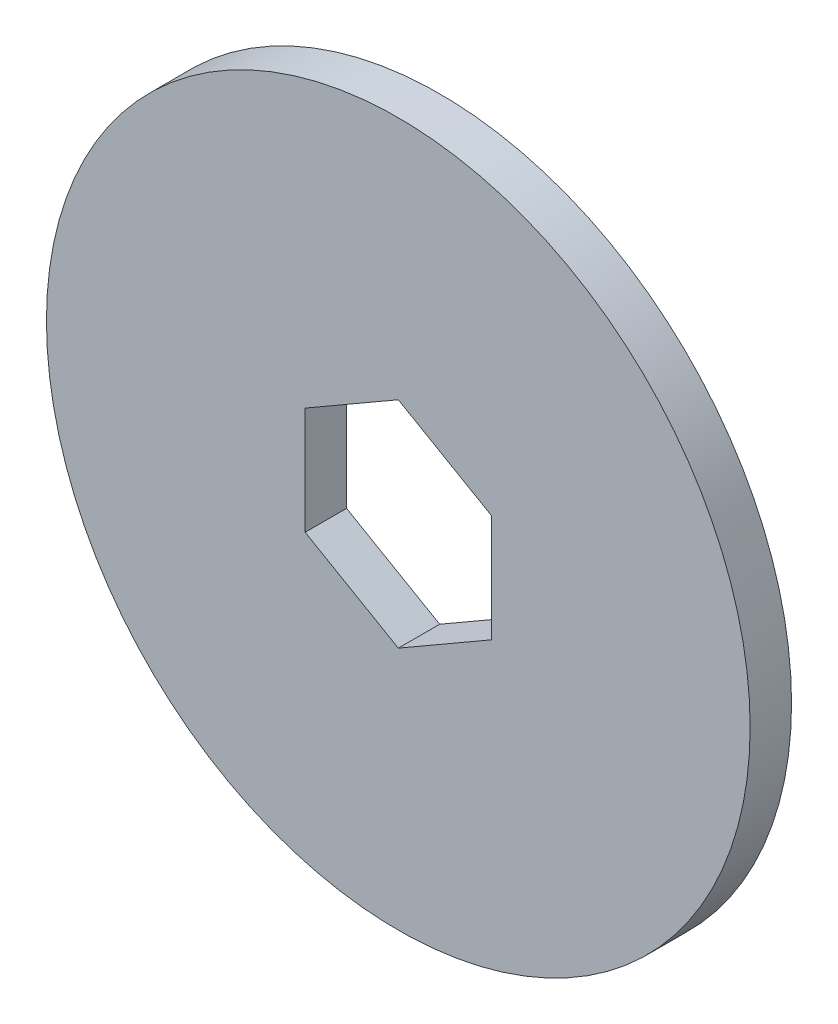
ISO-10303-21;
HEADER;
FILE_DESCRIPTION(('STEP AP214'),'2;1');
FILE_NAME('part.step','',(''),(''),'','','');
FILE_SCHEMA(('AUTOMOTIVE_DESIGN { 1 0 10303 214 1 1 1 1 }'));
ENDSEC;
DATA;
#1=APPLICATION_CONTEXT('core data for automotive mechanical design processes');
#2=APPLICATION_PROTOCOL_DEFINITION('international standard','automotive_design',2000,#1);
#3=PRODUCT_CONTEXT('',#1,'mechanical');
#4=PRODUCT('Part','Part','',(#3));
#5=PRODUCT_RELATED_PRODUCT_CATEGORY('part','',(#4));
#6=PRODUCT_DEFINITION_FORMATION('','',#4);
#7=PRODUCT_DEFINITION_CONTEXT('part definition',#1,'design');
#8=PRODUCT_DEFINITION('design','',#6,#7);
#9=PRODUCT_DEFINITION_SHAPE('','',#8);
#10=(LENGTH_UNIT() NAMED_UNIT(*) SI_UNIT(.MILLI.,.METRE.));
#11=(NAMED_UNIT(*) PLANE_ANGLE_UNIT() SI_UNIT($,.RADIAN.));
#12=(NAMED_UNIT(*) SI_UNIT($,.STERADIAN.) SOLID_ANGLE_UNIT());
#13=UNCERTAINTY_MEASURE_WITH_UNIT(LENGTH_MEASURE(1.E-05),#10,'distance_accuracy_value','');
#14=(GEOMETRIC_REPRESENTATION_CONTEXT(3) GLOBAL_UNCERTAINTY_ASSIGNED_CONTEXT((#13)) GLOBAL_UNIT_ASSIGNED_CONTEXT((#10,
#11,#12)) REPRESENTATION_CONTEXT('',''));
#15=CARTESIAN_POINT('',(0.,0.,0.));
#16=DIRECTION('',(0.,0.,1.));
#17=DIRECTION('',(1.,0.,0.));
#18=AXIS2_PLACEMENT_3D('',#15,#16,#17);
#19=CARTESIAN_POINT('',(642.300000000008,-191.99999999999,6.));
#20=DIRECTION('',(0.,0.,1.));
#21=DIRECTION('',(1.,0.,0.));
#22=AXIS2_PLACEMENT_3D('',#19,#20,#21);
#23=PLANE('',#22);
#24=DIRECTION('',(0.,-1.,0.));
#25=VECTOR('',#24,1.);
#26=CARTESIAN_POINT('',(628.800000000008,-184.20577136589,6.));
#27=LINE('',#26,#25);
#28=CARTESIAN_POINT('',(628.800000000008,-184.20577136589,6.));
#29=VERTEX_POINT('',#28);
#30=CARTESIAN_POINT('',(628.800000000008,-199.79422863409,6.));
#31=VERTEX_POINT('',#30);
#32=EDGE_CURVE('E94',#29,#31,#27,.T.);
#33=ORIENTED_EDGE('',*,*,#32,.F.);
#34=DIRECTION('',(-0.866025403786105,-0.499999999997114,0.));
#35=VECTOR('',#34,1.);
#36=CARTESIAN_POINT('',(642.300000000008,-176.41154273189,6.));
#37=LINE('',#36,#35);
#38=CARTESIAN_POINT('',(642.300000000008,-176.41154273189,6.));
#39=VERTEX_POINT('',#38);
#40=EDGE_CURVE('E87',#39,#29,#37,.T.);
#41=ORIENTED_EDGE('',*,*,#40,.F.);
#42=DIRECTION('',(-0.8660254037845,0.499999999999893,0.));
#43=VECTOR('',#42,1.);
#44=CARTESIAN_POINT('',(655.799999999908,-184.20577136589,6.));
#45=LINE('',#44,#43);
#46=CARTESIAN_POINT('',(655.799999999908,-184.20577136589,6.));
#47=VERTEX_POINT('',#46);
#48=EDGE_CURVE('E114',#47,#39,#45,.T.);
#49=ORIENTED_EDGE('',*,*,#48,.F.);
#50=DIRECTION('',(0.,1.,0.));
#51=VECTOR('',#50,1.);
#52=CARTESIAN_POINT('',(655.799999999908,-199.79422863409,6.));
#53=LINE('',#52,#51);
#54=CARTESIAN_POINT('',(655.799999999908,-199.79422863409,6.));
#55=VERTEX_POINT('',#54);
#56=EDGE_CURVE('E112',#55,#47,#53,.T.);
#57=ORIENTED_EDGE('',*,*,#56,.F.);
#58=DIRECTION('',(0.8660254037845,0.499999999999893,0.));
#59=VECTOR('',#58,1.);
#60=CARTESIAN_POINT('',(642.300000000008,-207.58845726809,6.));
#61=LINE('',#60,#59);
#62=CARTESIAN_POINT('',(642.300000000008,-207.58845726809,6.));
#63=VERTEX_POINT('',#62);
#64=EDGE_CURVE('E107',#63,#55,#61,.T.);
#65=ORIENTED_EDGE('',*,*,#64,.F.);
#66=DIRECTION('',(0.866025403786105,-0.499999999997114,0.));
#67=VECTOR('',#66,1.);
#68=CARTESIAN_POINT('',(628.800000000008,-199.79422863409,6.));
#69=LINE('',#68,#67);
#70=EDGE_CURVE('E105',#31,#63,#69,.T.);
#71=ORIENTED_EDGE('',*,*,#70,.F.);
#72=EDGE_LOOP('',(#33,#41,#49,#57,#65,#71));
#73=FACE_BOUND('',#72,.T.);
#74=CARTESIAN_POINT('',(642.300000000008,-191.99999999999,6.));
#75=DIRECTION('',(0.,0.,1.));
#76=DIRECTION('',(1.,0.,0.));
#77=AXIS2_PLACEMENT_3D('',#74,#75,#76);
#78=CIRCLE('',#77,51.0000000000001);
#79=CARTESIAN_POINT('',(693.300000000008,-191.99999999999,6.));
#80=VERTEX_POINT('',#79);
#81=EDGE_CURVE('E223',#80,#80,#78,.T.);
#82=ORIENTED_EDGE('',*,*,#81,.T.);
#83=EDGE_LOOP('',(#82));
#84=FACE_BOUND('',#83,.T.);
#85=ADVANCED_FACE('F35',(#73,#84),#23,.T.);
#86=CARTESIAN_POINT('',(642.300000000008,-191.99999999999,0.));
#87=DIRECTION('',(0.,0.,1.));
#88=DIRECTION('',(1.,0.,0.));
#89=AXIS2_PLACEMENT_3D('',#86,#87,#88);
#90=PLANE('',#89);
#91=DIRECTION('',(-0.866025403786105,-0.499999999997114,0.));
#92=VECTOR('',#91,1.);
#93=CARTESIAN_POINT('',(642.300000000008,-176.41154273189,0.));
#94=LINE('',#93,#92);
#95=CARTESIAN_POINT('',(642.300000000008,-176.41154273189,0.));
#96=VERTEX_POINT('',#95);
#97=CARTESIAN_POINT('',(628.800000000008,-184.20577136589,0.));
#98=VERTEX_POINT('',#97);
#99=EDGE_CURVE('E57',#96,#98,#94,.T.);
#100=ORIENTED_EDGE('',*,*,#99,.T.);
#101=DIRECTION('',(0.,-1.,0.));
#102=VECTOR('',#101,1.);
#103=CARTESIAN_POINT('',(628.800000000008,-184.20577136589,0.));
#104=LINE('',#103,#102);
#105=CARTESIAN_POINT('',(628.800000000008,-199.79422863409,0.));
#106=VERTEX_POINT('',#105);
#107=EDGE_CURVE('E101',#98,#106,#104,.T.);
#108=ORIENTED_EDGE('',*,*,#107,.T.);
#109=DIRECTION('',(0.866025403786105,-0.499999999997114,0.));
#110=VECTOR('',#109,1.);
#111=CARTESIAN_POINT('',(628.800000000008,-199.79422863409,0.));
#112=LINE('',#111,#110);
#113=CARTESIAN_POINT('',(642.300000000008,-207.58845726809,0.));
#114=VERTEX_POINT('',#113);
#115=EDGE_CURVE('E119',#106,#114,#112,.T.);
#116=ORIENTED_EDGE('',*,*,#115,.T.);
#117=DIRECTION('',(0.8660254037845,0.499999999999893,0.));
#118=VECTOR('',#117,1.);
#119=CARTESIAN_POINT('',(642.300000000008,-207.58845726809,0.));
#120=LINE('',#119,#118);
#121=CARTESIAN_POINT('',(655.799999999908,-199.79422863409,0.));
#122=VERTEX_POINT('',#121);
#123=EDGE_CURVE('E122',#114,#122,#120,.T.);
#124=ORIENTED_EDGE('',*,*,#123,.T.);
#125=DIRECTION('',(0.,1.,0.));
#126=VECTOR('',#125,1.);
#127=CARTESIAN_POINT('',(655.799999999908,-199.79422863409,0.));
#128=LINE('',#127,#126);
#129=CARTESIAN_POINT('',(655.799999999908,-184.20577136589,0.));
#130=VERTEX_POINT('',#129);
#131=EDGE_CURVE('E125',#122,#130,#128,.T.);
#132=ORIENTED_EDGE('',*,*,#131,.T.);
#133=DIRECTION('',(-0.8660254037845,0.499999999999893,0.));
#134=VECTOR('',#133,1.);
#135=CARTESIAN_POINT('',(655.799999999908,-184.20577136589,0.));
#136=LINE('',#135,#134);
#137=EDGE_CURVE('E95',#130,#96,#136,.T.);
#138=ORIENTED_EDGE('',*,*,#137,.T.);
#139=EDGE_LOOP('',(#100,#108,#116,#124,#132,#138));
#140=FACE_BOUND('',#139,.T.);
#141=CARTESIAN_POINT('',(642.300000000008,-191.99999999999,0.));
#142=DIRECTION('',(0.,0.,1.));
#143=DIRECTION('',(1.,0.,0.));
#144=AXIS2_PLACEMENT_3D('',#141,#142,#143);
#145=CIRCLE('',#144,51.0000000000001);
#146=CARTESIAN_POINT('',(693.300000000008,-191.99999999999,0.));
#147=VERTEX_POINT('',#146);
#148=EDGE_CURVE('E117',#147,#147,#145,.T.);
#149=ORIENTED_EDGE('',*,*,#148,.F.);
#150=EDGE_LOOP('',(#149));
#151=FACE_BOUND('',#150,.T.);
#152=ADVANCED_FACE('F37',(#140,#151),#90,.F.);
#153=CARTESIAN_POINT('',(642.300000000008,-176.41154273189,6.));
#154=DIRECTION('',(0.499999999997114,-0.866025403786105,0.));
#155=DIRECTION('',(0.866025403786105,0.499999999997114,0.));
#156=AXIS2_PLACEMENT_3D('',#153,#154,#155);
#157=PLANE('',#156);
#158=ORIENTED_EDGE('',*,*,#99,.F.);
#159=DIRECTION('',(0.,0.,-1.));
#160=VECTOR('',#159,1.);
#161=CARTESIAN_POINT('',(642.300000000008,-176.41154273189,6.));
#162=LINE('',#161,#160);
#163=EDGE_CURVE('E90',#39,#96,#162,.T.);
#164=ORIENTED_EDGE('',*,*,#163,.F.);
#165=ORIENTED_EDGE('',*,*,#40,.T.);
#166=DIRECTION('',(0.,0.,-1.));
#167=VECTOR('',#166,1.);
#168=CARTESIAN_POINT('',(628.800000000008,-184.20577136589,6.));
#169=LINE('',#168,#167);
#170=EDGE_CURVE('E11',#29,#98,#169,.T.);
#171=ORIENTED_EDGE('',*,*,#170,.T.);
#172=EDGE_LOOP('',(#158,#164,#165,#171));
#173=FACE_BOUND('',#172,.T.);
#174=ADVANCED_FACE('F89',(#173),#157,.T.);
#175=CARTESIAN_POINT('',(628.800000000008,-184.20577136589,6.));
#176=DIRECTION('',(1.,0.,0.));
#177=DIRECTION('',(0.,0.,-1.));
#178=AXIS2_PLACEMENT_3D('',#175,#176,#177);
#179=PLANE('',#178);
#180=ORIENTED_EDGE('',*,*,#107,.F.);
#181=ORIENTED_EDGE('',*,*,#170,.F.);
#182=ORIENTED_EDGE('',*,*,#32,.T.);
#183=DIRECTION('',(0.,0.,-1.));
#184=VECTOR('',#183,1.);
#185=CARTESIAN_POINT('',(628.800000000008,-199.79422863409,6.));
#186=LINE('',#185,#184);
#187=EDGE_CURVE('E43',#31,#106,#186,.T.);
#188=ORIENTED_EDGE('',*,*,#187,.T.);
#189=EDGE_LOOP('',(#180,#181,#182,#188));
#190=FACE_BOUND('',#189,.T.);
#191=ADVANCED_FACE('F98',(#190),#179,.T.);
#192=CARTESIAN_POINT('',(628.800000000008,-199.79422863409,6.));
#193=DIRECTION('',(0.499999999997114,0.866025403786105,0.));
#194=DIRECTION('',(-0.866025403786105,0.499999999997114,0.));
#195=AXIS2_PLACEMENT_3D('',#192,#193,#194);
#196=PLANE('',#195);
#197=ORIENTED_EDGE('',*,*,#115,.F.);
#198=ORIENTED_EDGE('',*,*,#187,.F.);
#199=ORIENTED_EDGE('',*,*,#70,.T.);
#200=DIRECTION('',(0.,0.,-1.));
#201=VECTOR('',#200,1.);
#202=CARTESIAN_POINT('',(642.300000000008,-207.58845726809,6.));
#203=LINE('',#202,#201);
#204=EDGE_CURVE('E134',#63,#114,#203,.T.);
#205=ORIENTED_EDGE('',*,*,#204,.T.);
#206=EDGE_LOOP('',(#197,#198,#199,#205));
#207=FACE_BOUND('',#206,.T.);
#208=ADVANCED_FACE('F137',(#207),#196,.T.);
#209=CARTESIAN_POINT('',(642.300000000008,-207.58845726809,6.));
#210=DIRECTION('',(-0.499999999999893,0.866025403784501,0.));
#211=DIRECTION('',(-0.866025403784501,-0.499999999999893,0.));
#212=AXIS2_PLACEMENT_3D('',#209,#210,#211);
#213=PLANE('',#212);
#214=ORIENTED_EDGE('',*,*,#123,.F.);
#215=ORIENTED_EDGE('',*,*,#204,.F.);
#216=ORIENTED_EDGE('',*,*,#64,.T.);
#217=DIRECTION('',(0.,0.,-1.));
#218=VECTOR('',#217,1.);
#219=CARTESIAN_POINT('',(655.799999999908,-199.79422863409,6.));
#220=LINE('',#219,#218);
#221=EDGE_CURVE('E132',#55,#122,#220,.T.);
#222=ORIENTED_EDGE('',*,*,#221,.T.);
#223=EDGE_LOOP('',(#214,#215,#216,#222));
#224=FACE_BOUND('',#223,.T.);
#225=ADVANCED_FACE('F149',(#224),#213,.T.);
#226=CARTESIAN_POINT('',(655.799999999908,-199.79422863409,6.));
#227=DIRECTION('',(-1.,0.,0.));
#228=DIRECTION('',(0.,0.,1.));
#229=AXIS2_PLACEMENT_3D('',#226,#227,#228);
#230=PLANE('',#229);
#231=ORIENTED_EDGE('',*,*,#131,.F.);
#232=ORIENTED_EDGE('',*,*,#221,.F.);
#233=ORIENTED_EDGE('',*,*,#56,.T.);
#234=DIRECTION('',(0.,0.,-1.));
#235=VECTOR('',#234,1.);
#236=CARTESIAN_POINT('',(655.799999999908,-184.20577136589,6.));
#237=LINE('',#236,#235);
#238=EDGE_CURVE('E50',#47,#130,#237,.T.);
#239=ORIENTED_EDGE('',*,*,#238,.T.);
#240=EDGE_LOOP('',(#231,#232,#233,#239));
#241=FACE_BOUND('',#240,.T.);
#242=ADVANCED_FACE('F147',(#241),#230,.T.);
#243=CARTESIAN_POINT('',(655.799999999908,-184.20577136589,6.));
#244=DIRECTION('',(-0.499999999999893,-0.866025403784501,0.));
#245=DIRECTION('',(0.866025403784501,-0.499999999999893,0.));
#246=AXIS2_PLACEMENT_3D('',#243,#244,#245);
#247=PLANE('',#246);
#248=ORIENTED_EDGE('',*,*,#137,.F.);
#249=ORIENTED_EDGE('',*,*,#238,.F.);
#250=ORIENTED_EDGE('',*,*,#48,.T.);
#251=ORIENTED_EDGE('',*,*,#163,.T.);
#252=EDGE_LOOP('',(#248,#249,#250,#251));
#253=FACE_BOUND('',#252,.T.);
#254=ADVANCED_FACE('F143',(#253),#247,.T.);
#255=CARTESIAN_POINT('',(642.300000000008,-191.99999999999,0.));
#256=DIRECTION('',(0.,0.,1.));
#257=DIRECTION('',(1.,0.,0.));
#258=AXIS2_PLACEMENT_3D('',#255,#256,#257);
#259=CYLINDRICAL_SURFACE('',#258,51.0000000000001);
#260=ORIENTED_EDGE('',*,*,#148,.T.);
#261=EDGE_LOOP('',(#260));
#262=FACE_BOUND('',#261,.T.);
#263=ORIENTED_EDGE('',*,*,#81,.F.);
#264=EDGE_LOOP('',(#263));
#265=FACE_BOUND('',#264,.T.);
#266=ADVANCED_FACE('F192',(#262,#265),#259,.T.);
#267=CLOSED_SHELL('',(#85,#152,#174,#191,#208,#225,#242,#254,#266));
#268=MANIFOLD_SOLID_BREP('B2',#267);
#269=ADVANCED_BREP_SHAPE_REPRESENTATION('',(#18,#268),#14);
#270=SHAPE_DEFINITION_REPRESENTATION(#9,#269);
ENDSEC;
END-ISO-10303-21;
